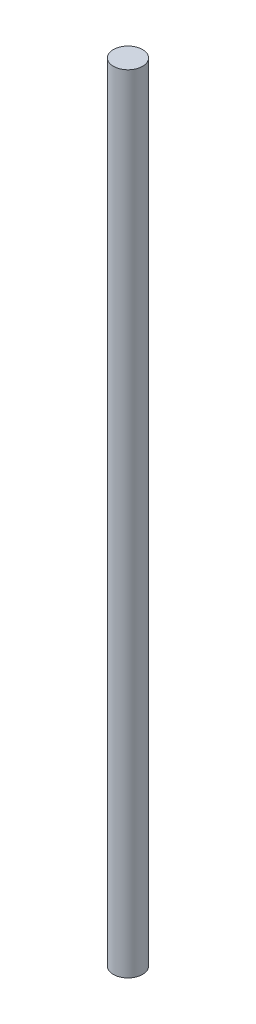
ISO-10303-21;
HEADER;
FILE_DESCRIPTION(('STEP AP214'),'2;1');
FILE_NAME('part.step','',(''),(''),'','','');
FILE_SCHEMA(('AUTOMOTIVE_DESIGN { 1 0 10303 214 1 1 1 1 }'));
ENDSEC;
DATA;
#1=APPLICATION_CONTEXT('core data for automotive mechanical design processes');
#2=APPLICATION_PROTOCOL_DEFINITION('international standard','automotive_design',2000,#1);
#3=PRODUCT_CONTEXT('',#1,'mechanical');
#4=PRODUCT('Part','Part','',(#3));
#5=PRODUCT_RELATED_PRODUCT_CATEGORY('part','',(#4));
#6=PRODUCT_DEFINITION_FORMATION('','',#4);
#7=PRODUCT_DEFINITION_CONTEXT('part definition',#1,'design');
#8=PRODUCT_DEFINITION('design','',#6,#7);
#9=PRODUCT_DEFINITION_SHAPE('','',#8);
#10=(LENGTH_UNIT() NAMED_UNIT(*) SI_UNIT(.MILLI.,.METRE.));
#11=(NAMED_UNIT(*) PLANE_ANGLE_UNIT() SI_UNIT($,.RADIAN.));
#12=(NAMED_UNIT(*) SI_UNIT($,.STERADIAN.) SOLID_ANGLE_UNIT());
#13=UNCERTAINTY_MEASURE_WITH_UNIT(LENGTH_MEASURE(1.E-05),#10,'distance_accuracy_value','');
#14=(GEOMETRIC_REPRESENTATION_CONTEXT(3) GLOBAL_UNCERTAINTY_ASSIGNED_CONTEXT((#13)) GLOBAL_UNIT_ASSIGNED_CONTEXT((#10,
#11,#12)) REPRESENTATION_CONTEXT('',''));
#15=CARTESIAN_POINT('',(0.,0.,0.));
#16=DIRECTION('',(0.,0.,1.));
#17=DIRECTION('',(1.,0.,0.));
#18=AXIS2_PLACEMENT_3D('',#15,#16,#17);
#19=CARTESIAN_POINT('',(0.,171.45,0.));
#20=DIRECTION('',(0.,-1.,0.));
#21=DIRECTION('',(0.,0.,-1.));
#22=AXIS2_PLACEMENT_3D('',#19,#20,#21);
#23=CYLINDRICAL_SURFACE('',#22,3.175);
#24=CARTESIAN_POINT('',(0.,171.45,0.));
#25=DIRECTION('',(0.,1.,0.));
#26=DIRECTION('',(0.,0.,1.));
#27=AXIS2_PLACEMENT_3D('',#24,#25,#26);
#28=CIRCLE('',#27,3.175);
#29=CARTESIAN_POINT('',(0.,171.45,3.175));
#30=VERTEX_POINT('',#29);
#31=EDGE_CURVE('E10',#30,#30,#28,.T.);
#32=ORIENTED_EDGE('',*,*,#31,.F.);
#33=EDGE_LOOP('',(#32));
#34=FACE_BOUND('',#33,.T.);
#35=CARTESIAN_POINT('',(0.,0.,0.));
#36=DIRECTION('',(0.,1.,0.));
#37=DIRECTION('',(0.,0.,1.));
#38=AXIS2_PLACEMENT_3D('',#35,#36,#37);
#39=CIRCLE('',#38,3.175);
#40=CARTESIAN_POINT('',(0.,0.,3.175));
#41=VERTEX_POINT('',#40);
#42=EDGE_CURVE('E33',#41,#41,#39,.T.);
#43=ORIENTED_EDGE('',*,*,#42,.T.);
#44=EDGE_LOOP('',(#43));
#45=FACE_BOUND('',#44,.T.);
#46=ADVANCED_FACE('F30',(#34,#45),#23,.T.);
#47=CARTESIAN_POINT('',(0.,171.45,0.));
#48=DIRECTION('',(0.,1.,0.));
#49=DIRECTION('',(0.,0.,1.));
#50=AXIS2_PLACEMENT_3D('',#47,#48,#49);
#51=PLANE('',#50);
#52=ORIENTED_EDGE('',*,*,#31,.T.);
#53=EDGE_LOOP('',(#52));
#54=FACE_BOUND('',#53,.T.);
#55=ADVANCED_FACE('F45',(#54),#51,.T.);
#56=CARTESIAN_POINT('',(0.,0.,0.));
#57=DIRECTION('',(0.,1.,0.));
#58=DIRECTION('',(0.,0.,1.));
#59=AXIS2_PLACEMENT_3D('',#56,#57,#58);
#60=PLANE('',#59);
#61=ORIENTED_EDGE('',*,*,#42,.F.);
#62=EDGE_LOOP('',(#61));
#63=FACE_BOUND('',#62,.T.);
#64=ADVANCED_FACE('F43',(#63),#60,.F.);
#65=CLOSED_SHELL('',(#46,#55,#64));
#66=MANIFOLD_SOLID_BREP('B2',#65);
#67=ADVANCED_BREP_SHAPE_REPRESENTATION('',(#18,#66),#14);
#68=SHAPE_DEFINITION_REPRESENTATION(#9,#67);
ENDSEC;
END-ISO-10303-21;
